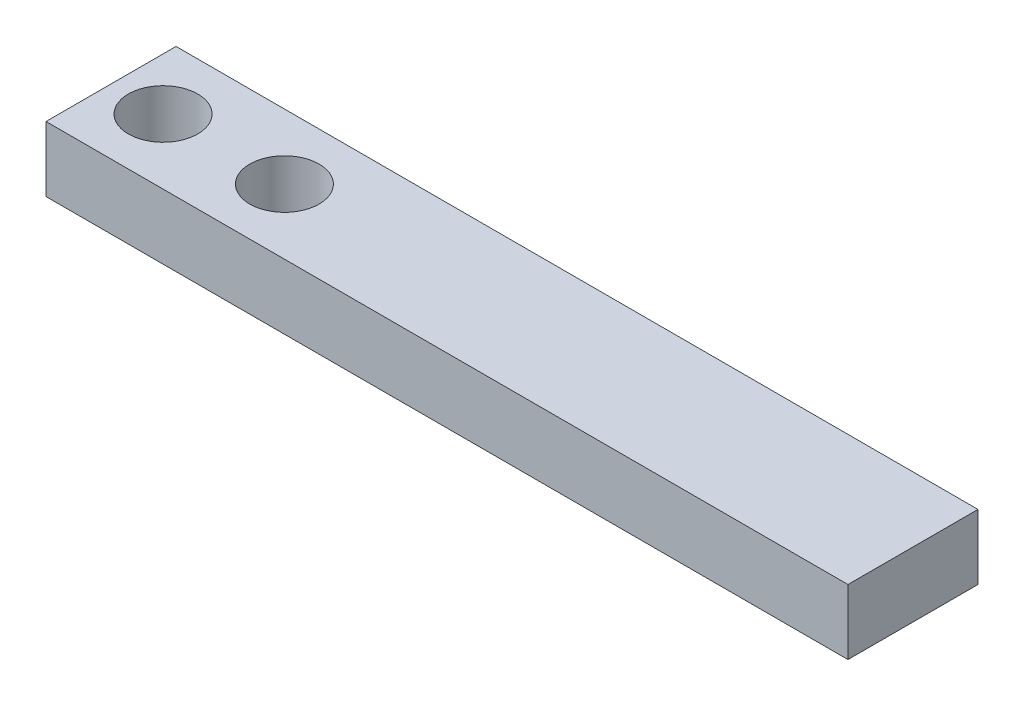
ISO-10303-21;
HEADER;
FILE_DESCRIPTION(('STEP AP214'),'2;1');
FILE_NAME('part.step','',(''),(''),'','','');
FILE_SCHEMA(('AUTOMOTIVE_DESIGN { 1 0 10303 214 1 1 1 1 }'));
ENDSEC;
DATA;
#1=APPLICATION_CONTEXT('core data for automotive mechanical design processes');
#2=APPLICATION_PROTOCOL_DEFINITION('international standard','automotive_design',2000,#1);
#3=PRODUCT_CONTEXT('',#1,'mechanical');
#4=PRODUCT('Part','Part','',(#3));
#5=PRODUCT_RELATED_PRODUCT_CATEGORY('part','',(#4));
#6=PRODUCT_DEFINITION_FORMATION('','',#4);
#7=PRODUCT_DEFINITION_CONTEXT('part definition',#1,'design');
#8=PRODUCT_DEFINITION('design','',#6,#7);
#9=PRODUCT_DEFINITION_SHAPE('','',#8);
#10=(LENGTH_UNIT() NAMED_UNIT(*) SI_UNIT(.MILLI.,.METRE.));
#11=(NAMED_UNIT(*) PLANE_ANGLE_UNIT() SI_UNIT($,.RADIAN.));
#12=(NAMED_UNIT(*) SI_UNIT($,.STERADIAN.) SOLID_ANGLE_UNIT());
#13=UNCERTAINTY_MEASURE_WITH_UNIT(LENGTH_MEASURE(1.E-05),#10,'distance_accuracy_value','');
#14=(GEOMETRIC_REPRESENTATION_CONTEXT(3) GLOBAL_UNCERTAINTY_ASSIGNED_CONTEXT((#13)) GLOBAL_UNIT_ASSIGNED_CONTEXT((#10,
#11,#12)) REPRESENTATION_CONTEXT('',''));
#15=CARTESIAN_POINT('',(0.,0.,0.));
#16=DIRECTION('',(0.,0.,1.));
#17=DIRECTION('',(1.,0.,0.));
#18=AXIS2_PLACEMENT_3D('',#15,#16,#17);
#19=CARTESIAN_POINT('',(0.,1.5,0.));
#20=DIRECTION('',(1.,0.,0.));
#21=DIRECTION('',(0.,0.,-1.));
#22=AXIS2_PLACEMENT_3D('',#19,#20,#21);
#23=PLANE('',#22);
#24=DIRECTION('',(0.,0.,1.));
#25=VECTOR('',#24,1.);
#26=CARTESIAN_POINT('',(0.,0.,0.));
#27=LINE('',#26,#25);
#28=CARTESIAN_POINT('',(0.,0.,-3.));
#29=VERTEX_POINT('',#28);
#30=CARTESIAN_POINT('',(0.,0.,0.));
#31=VERTEX_POINT('',#30);
#32=EDGE_CURVE('E97',#29,#31,#27,.T.);
#33=ORIENTED_EDGE('',*,*,#32,.T.);
#34=DIRECTION('',(0.,-1.,0.));
#35=VECTOR('',#34,1.);
#36=CARTESIAN_POINT('',(0.,1.5,0.));
#37=LINE('',#36,#35);
#38=CARTESIAN_POINT('',(0.,1.5,0.));
#39=VERTEX_POINT('',#38);
#40=EDGE_CURVE('E11',#39,#31,#37,.T.);
#41=ORIENTED_EDGE('',*,*,#40,.F.);
#42=DIRECTION('',(0.,0.,1.));
#43=VECTOR('',#42,1.);
#44=CARTESIAN_POINT('',(0.,1.5,0.));
#45=LINE('',#44,#43);
#46=CARTESIAN_POINT('',(0.,1.5,-3.));
#47=VERTEX_POINT('',#46);
#48=EDGE_CURVE('E85',#47,#39,#45,.T.);
#49=ORIENTED_EDGE('',*,*,#48,.F.);
#50=DIRECTION('',(0.,-1.,0.));
#51=VECTOR('',#50,1.);
#52=CARTESIAN_POINT('',(0.,1.5,-3.));
#53=LINE('',#52,#51);
#54=EDGE_CURVE('E93',#47,#29,#53,.T.);
#55=ORIENTED_EDGE('',*,*,#54,.T.);
#56=EDGE_LOOP('',(#33,#41,#49,#55));
#57=FACE_BOUND('',#56,.T.);
#58=ADVANCED_FACE('F34',(#57),#23,.F.);
#59=CARTESIAN_POINT('',(0.,1.5,0.));
#60=DIRECTION('',(0.,0.,-1.));
#61=DIRECTION('',(-1.,0.,0.));
#62=AXIS2_PLACEMENT_3D('',#59,#60,#61);
#63=PLANE('',#62);
#64=DIRECTION('',(1.,0.,0.));
#65=VECTOR('',#64,1.);
#66=CARTESIAN_POINT('',(0.,0.,0.));
#67=LINE('',#66,#65);
#68=CARTESIAN_POINT('',(18.5,0.,0.));
#69=VERTEX_POINT('',#68);
#70=EDGE_CURVE('E89',#31,#69,#67,.T.);
#71=ORIENTED_EDGE('',*,*,#70,.T.);
#72=DIRECTION('',(0.,-1.,0.));
#73=VECTOR('',#72,1.);
#74=CARTESIAN_POINT('',(18.5,1.5,0.));
#75=LINE('',#74,#73);
#76=CARTESIAN_POINT('',(18.5,1.5,0.));
#77=VERTEX_POINT('',#76);
#78=EDGE_CURVE('E42',#77,#69,#75,.T.);
#79=ORIENTED_EDGE('',*,*,#78,.F.);
#80=DIRECTION('',(1.,0.,0.));
#81=VECTOR('',#80,1.);
#82=CARTESIAN_POINT('',(0.,1.5,0.));
#83=LINE('',#82,#81);
#84=EDGE_CURVE('E80',#39,#77,#83,.T.);
#85=ORIENTED_EDGE('',*,*,#84,.F.);
#86=ORIENTED_EDGE('',*,*,#40,.T.);
#87=EDGE_LOOP('',(#71,#79,#85,#86));
#88=FACE_BOUND('',#87,.T.);
#89=ADVANCED_FACE('F88',(#88),#63,.F.);
#90=CARTESIAN_POINT('',(18.5,1.5,0.));
#91=DIRECTION('',(-1.,0.,0.));
#92=DIRECTION('',(0.,0.,1.));
#93=AXIS2_PLACEMENT_3D('',#90,#91,#92);
#94=PLANE('',#93);
#95=DIRECTION('',(0.,0.,-1.));
#96=VECTOR('',#95,1.);
#97=CARTESIAN_POINT('',(18.5,0.,0.));
#98=LINE('',#97,#96);
#99=CARTESIAN_POINT('',(18.5,0.,-3.));
#100=VERTEX_POINT('',#99);
#101=EDGE_CURVE('E67',#69,#100,#98,.T.);
#102=ORIENTED_EDGE('',*,*,#101,.T.);
#103=DIRECTION('',(0.,-1.,0.));
#104=VECTOR('',#103,1.);
#105=CARTESIAN_POINT('',(18.5,1.5,-3.));
#106=LINE('',#105,#104);
#107=CARTESIAN_POINT('',(18.5,1.5,-3.));
#108=VERTEX_POINT('',#107);
#109=EDGE_CURVE('E90',#108,#100,#106,.T.);
#110=ORIENTED_EDGE('',*,*,#109,.F.);
#111=DIRECTION('',(0.,0.,-1.));
#112=VECTOR('',#111,1.);
#113=CARTESIAN_POINT('',(18.5,1.5,0.));
#114=LINE('',#113,#112);
#115=EDGE_CURVE('E83',#77,#108,#114,.T.);
#116=ORIENTED_EDGE('',*,*,#115,.F.);
#117=ORIENTED_EDGE('',*,*,#78,.T.);
#118=EDGE_LOOP('',(#102,#110,#116,#117));
#119=FACE_BOUND('',#118,.T.);
#120=ADVANCED_FACE('F91',(#119),#94,.F.);
#121=CARTESIAN_POINT('',(0.,1.5,-3.));
#122=DIRECTION('',(0.,0.,1.));
#123=DIRECTION('',(1.,0.,0.));
#124=AXIS2_PLACEMENT_3D('',#121,#122,#123);
#125=PLANE('',#124);
#126=DIRECTION('',(-1.,0.,0.));
#127=VECTOR('',#126,1.);
#128=CARTESIAN_POINT('',(0.,0.,-3.));
#129=LINE('',#128,#127);
#130=EDGE_CURVE('E73',#100,#29,#129,.T.);
#131=ORIENTED_EDGE('',*,*,#130,.T.);
#132=ORIENTED_EDGE('',*,*,#54,.F.);
#133=DIRECTION('',(-1.,0.,0.));
#134=VECTOR('',#133,1.);
#135=CARTESIAN_POINT('',(0.,1.5,-3.));
#136=LINE('',#135,#134);
#137=EDGE_CURVE('E50',#108,#47,#136,.T.);
#138=ORIENTED_EDGE('',*,*,#137,.F.);
#139=ORIENTED_EDGE('',*,*,#109,.T.);
#140=EDGE_LOOP('',(#131,#132,#138,#139));
#141=FACE_BOUND('',#140,.T.);
#142=ADVANCED_FACE('F105',(#141),#125,.F.);
#143=CARTESIAN_POINT('',(0.,1.5,0.));
#144=DIRECTION('',(0.,-1.,0.));
#145=DIRECTION('',(0.,0.,-1.));
#146=AXIS2_PLACEMENT_3D('',#143,#144,#145);
#147=PLANE('',#146);
#148=CARTESIAN_POINT('',(1.2,1.5,-1.5));
#149=DIRECTION('',(0.,1.,0.));
#150=DIRECTION('',(0.,0.,1.));
#151=AXIS2_PLACEMENT_3D('',#148,#149,#150);
#152=CIRCLE('',#151,0.800000050999987);
#153=CARTESIAN_POINT('',(1.2,1.5,-0.699999949000012));
#154=VERTEX_POINT('',#153);
#155=EDGE_CURVE('E119',#154,#154,#152,.T.);
#156=ORIENTED_EDGE('',*,*,#155,.F.);
#157=EDGE_LOOP('',(#156));
#158=FACE_BOUND('',#157,.T.);
#159=CARTESIAN_POINT('',(4.,1.5,-1.5));
#160=DIRECTION('',(0.,1.,0.));
#161=DIRECTION('',(0.,0.,1.));
#162=AXIS2_PLACEMENT_3D('',#159,#160,#161);
#163=CIRCLE('',#162,0.800000050999988);
#164=CARTESIAN_POINT('',(4.,1.5,-0.699999949000012));
#165=VERTEX_POINT('',#164);
#166=EDGE_CURVE('E113',#165,#165,#163,.T.);
#167=ORIENTED_EDGE('',*,*,#166,.F.);
#168=EDGE_LOOP('',(#167));
#169=FACE_BOUND('',#168,.T.);
#170=ORIENTED_EDGE('',*,*,#48,.T.);
#171=ORIENTED_EDGE('',*,*,#84,.T.);
#172=ORIENTED_EDGE('',*,*,#115,.T.);
#173=ORIENTED_EDGE('',*,*,#137,.T.);
#174=EDGE_LOOP('',(#170,#171,#172,#173));
#175=FACE_BOUND('',#174,.T.);
#176=ADVANCED_FACE('F81',(#158,#169,#175),#147,.F.);
#177=CARTESIAN_POINT('',(0.,0.,0.));
#178=DIRECTION('',(0.,-1.,0.));
#179=DIRECTION('',(0.,0.,-1.));
#180=AXIS2_PLACEMENT_3D('',#177,#178,#179);
#181=PLANE('',#180);
#182=CARTESIAN_POINT('',(1.2,0.,-1.5));
#183=DIRECTION('',(0.,1.,0.));
#184=DIRECTION('',(0.,0.,1.));
#185=AXIS2_PLACEMENT_3D('',#182,#183,#184);
#186=CIRCLE('',#185,0.800000050999999);
#187=CARTESIAN_POINT('',(1.2,0.,-0.699999949000001));
#188=VERTEX_POINT('',#187);
#189=EDGE_CURVE('E116',#188,#188,#186,.T.);
#190=ORIENTED_EDGE('',*,*,#189,.T.);
#191=EDGE_LOOP('',(#190));
#192=FACE_BOUND('',#191,.T.);
#193=CARTESIAN_POINT('',(4.,0.,-1.5));
#194=DIRECTION('',(0.,1.,0.));
#195=DIRECTION('',(0.,0.,1.));
#196=AXIS2_PLACEMENT_3D('',#193,#194,#195);
#197=CIRCLE('',#196,0.800000050999998);
#198=CARTESIAN_POINT('',(4.,0.,-0.699999949000002));
#199=VERTEX_POINT('',#198);
#200=EDGE_CURVE('E100',#199,#199,#197,.T.);
#201=ORIENTED_EDGE('',*,*,#200,.T.);
#202=EDGE_LOOP('',(#201));
#203=FACE_BOUND('',#202,.T.);
#204=ORIENTED_EDGE('',*,*,#32,.F.);
#205=ORIENTED_EDGE('',*,*,#130,.F.);
#206=ORIENTED_EDGE('',*,*,#101,.F.);
#207=ORIENTED_EDGE('',*,*,#70,.F.);
#208=EDGE_LOOP('',(#204,#205,#206,#207));
#209=FACE_BOUND('',#208,.T.);
#210=ADVANCED_FACE('F108',(#192,#203,#209),#181,.T.);
#211=CARTESIAN_POINT('',(4.,1.5,-1.5));
#212=DIRECTION('',(0.,1.,0.));
#213=DIRECTION('',(0.,0.,1.));
#214=AXIS2_PLACEMENT_3D('',#211,#212,#213);
#215=CYLINDRICAL_SURFACE('',#214,0.800000050999993);
#216=ORIENTED_EDGE('',*,*,#200,.F.);
#217=EDGE_LOOP('',(#216));
#218=FACE_BOUND('',#217,.T.);
#219=ORIENTED_EDGE('',*,*,#166,.T.);
#220=EDGE_LOOP('',(#219));
#221=FACE_BOUND('',#220,.T.);
#222=ADVANCED_FACE('F130',(#218,#221),#215,.F.);
#223=CARTESIAN_POINT('',(1.2,1.5,-1.5));
#224=DIRECTION('',(0.,1.,0.));
#225=DIRECTION('',(0.,0.,1.));
#226=AXIS2_PLACEMENT_3D('',#223,#224,#225);
#227=CYLINDRICAL_SURFACE('',#226,0.800000050999993);
#228=ORIENTED_EDGE('',*,*,#189,.F.);
#229=EDGE_LOOP('',(#228));
#230=FACE_BOUND('',#229,.T.);
#231=ORIENTED_EDGE('',*,*,#155,.T.);
#232=EDGE_LOOP('',(#231));
#233=FACE_BOUND('',#232,.T.);
#234=ADVANCED_FACE('F123',(#230,#233),#227,.F.);
#235=CLOSED_SHELL('',(#58,#89,#120,#142,#176,#210,#222,#234));
#236=MANIFOLD_SOLID_BREP('B2',#235);
#237=ADVANCED_BREP_SHAPE_REPRESENTATION('',(#18,#236),#14);
#238=SHAPE_DEFINITION_REPRESENTATION(#9,#237);
ENDSEC;
END-ISO-10303-21;
